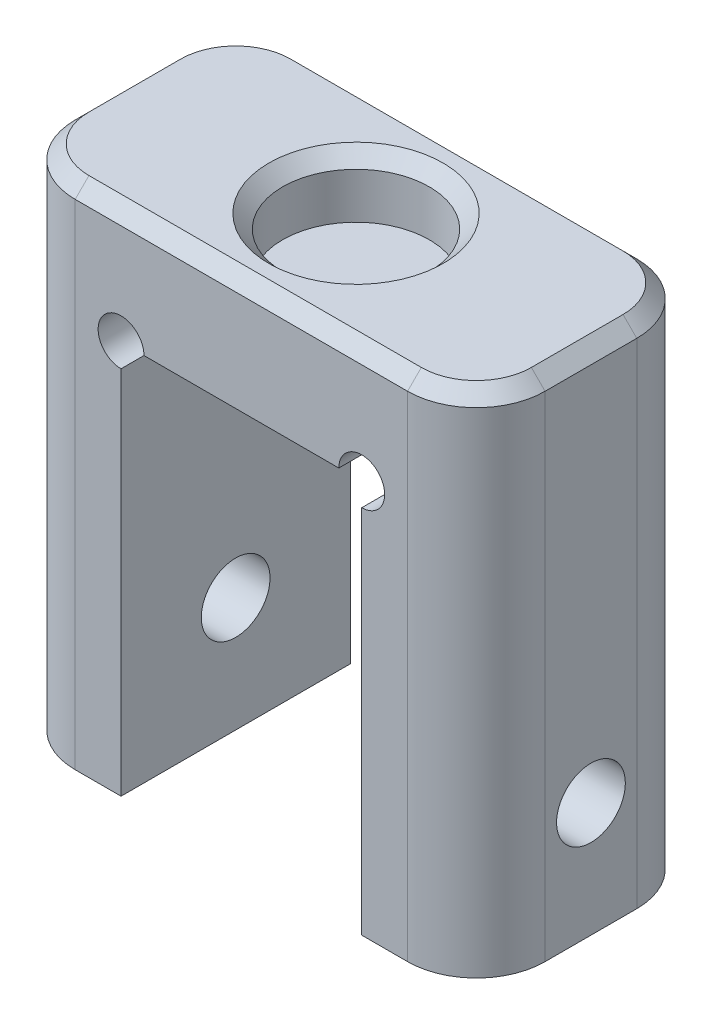
ISO-10303-21;
HEADER;
FILE_DESCRIPTION(('STEP AP214'),'2;1');
FILE_NAME('part.step','',(''),(''),'','','');
FILE_SCHEMA(('AUTOMOTIVE_DESIGN { 1 0 10303 214 1 1 1 1 }'));
ENDSEC;
DATA;
#1=APPLICATION_CONTEXT('core data for automotive mechanical design processes');
#2=APPLICATION_PROTOCOL_DEFINITION('international standard','automotive_design',2000,#1);
#3=PRODUCT_CONTEXT('',#1,'mechanical');
#4=PRODUCT('Part','Part','',(#3));
#5=PRODUCT_RELATED_PRODUCT_CATEGORY('part','',(#4));
#6=PRODUCT_DEFINITION_FORMATION('','',#4);
#7=PRODUCT_DEFINITION_CONTEXT('part definition',#1,'design');
#8=PRODUCT_DEFINITION('design','',#6,#7);
#9=PRODUCT_DEFINITION_SHAPE('','',#8);
#10=(LENGTH_UNIT() NAMED_UNIT(*) SI_UNIT(.MILLI.,.METRE.));
#11=(NAMED_UNIT(*) PLANE_ANGLE_UNIT() SI_UNIT($,.RADIAN.));
#12=(NAMED_UNIT(*) SI_UNIT($,.STERADIAN.) SOLID_ANGLE_UNIT());
#13=UNCERTAINTY_MEASURE_WITH_UNIT(LENGTH_MEASURE(1.E-05),#10,'distance_accuracy_value','');
#14=(GEOMETRIC_REPRESENTATION_CONTEXT(3) GLOBAL_UNCERTAINTY_ASSIGNED_CONTEXT((#13)) GLOBAL_UNIT_ASSIGNED_CONTEXT((#10,
#11,#12)) REPRESENTATION_CONTEXT('',''));
#15=CARTESIAN_POINT('',(0.,0.,0.));
#16=DIRECTION('',(0.,0.,1.));
#17=DIRECTION('',(1.,0.,0.));
#18=AXIS2_PLACEMENT_3D('',#15,#16,#17);
#19=CARTESIAN_POINT('',(0.,6.075,10.));
#20=DIRECTION('',(0.,1.,0.));
#21=DIRECTION('',(0.,0.,1.));
#22=AXIS2_PLACEMENT_3D('',#19,#20,#21);
#23=PLANE('',#22);
#24=DIRECTION('',(1.,0.,0.));
#25=VECTOR('',#24,1.);
#26=CARTESIAN_POINT('',(0.,6.075,0.));
#27=LINE('',#26,#25);
#28=CARTESIAN_POINT('',(-4.25,6.075,0.));
#29=VERTEX_POINT('',#28);
#30=CARTESIAN_POINT('',(4.25,6.075,0.));
#31=VERTEX_POINT('',#30);
#32=EDGE_CURVE('E180',#29,#31,#27,.T.);
#33=ORIENTED_EDGE('',*,*,#32,.T.);
#34=DIRECTION('',(0.,0.,1.));
#35=VECTOR('',#34,1.);
#36=CARTESIAN_POINT('',(4.25,6.075,0.));
#37=LINE('',#36,#35);
#38=CARTESIAN_POINT('',(4.25,6.075,10.));
#39=VERTEX_POINT('',#38);
#40=EDGE_CURVE('E67',#31,#39,#37,.T.);
#41=ORIENTED_EDGE('',*,*,#40,.T.);
#42=DIRECTION('',(1.,0.,0.));
#43=VECTOR('',#42,1.);
#44=CARTESIAN_POINT('',(0.,6.075,10.));
#45=LINE('',#44,#43);
#46=CARTESIAN_POINT('',(-4.25,6.075,10.));
#47=VERTEX_POINT('',#46);
#48=EDGE_CURVE('E182',#47,#39,#45,.T.);
#49=ORIENTED_EDGE('',*,*,#48,.F.);
#50=DIRECTION('',(0.,0.,1.));
#51=VECTOR('',#50,1.);
#52=CARTESIAN_POINT('',(-4.25,6.075,0.));
#53=LINE('',#52,#51);
#54=EDGE_CURVE('E168',#47,#29,#53,.F.);
#55=ORIENTED_EDGE('',*,*,#54,.T.);
#56=EDGE_LOOP('',(#33,#41,#49,#55));
#57=FACE_BOUND('',#56,.T.);
#58=ADVANCED_FACE('F42',(#57),#23,.F.);
#59=CARTESIAN_POINT('',(5.25,0.,10.));
#60=DIRECTION('',(1.,0.,0.));
#61=DIRECTION('',(0.,1.,0.));
#62=AXIS2_PLACEMENT_3D('',#59,#60,#61);
#63=PLANE('',#62);
#64=CARTESIAN_POINT('',(5.25000000000001,-6.07499999999999,5.));
#65=DIRECTION('',(1.,0.,0.));
#66=DIRECTION('',(0.,1.,0.));
#67=AXIS2_PLACEMENT_3D('',#64,#65,#66);
#68=CIRCLE('',#67,1.5);
#69=CARTESIAN_POINT('',(5.25000000000001,-4.57499999999999,5.));
#70=VERTEX_POINT('',#69);
#71=EDGE_CURVE('E197',#70,#70,#68,.T.);
#72=ORIENTED_EDGE('',*,*,#71,.T.);
#73=EDGE_LOOP('',(#72));
#74=FACE_BOUND('',#73,.T.);
#75=DIRECTION('',(0.,-1.,0.));
#76=VECTOR('',#75,1.);
#77=CARTESIAN_POINT('',(5.25,0.,10.));
#78=LINE('',#77,#76);
#79=CARTESIAN_POINT('',(5.25,5.075,10.));
#80=VERTEX_POINT('',#79);
#81=CARTESIAN_POINT('',(5.25000000000001,-11.075,10.));
#82=VERTEX_POINT('',#81);
#83=EDGE_CURVE('E376',#80,#82,#78,.T.);
#84=ORIENTED_EDGE('',*,*,#83,.F.);
#85=DIRECTION('',(0.,0.,1.));
#86=VECTOR('',#85,1.);
#87=CARTESIAN_POINT('',(5.25,5.075,0.));
#88=LINE('',#87,#86);
#89=CARTESIAN_POINT('',(5.25,5.075,0.));
#90=VERTEX_POINT('',#89);
#91=EDGE_CURVE('E184',#80,#90,#88,.F.);
#92=ORIENTED_EDGE('',*,*,#91,.T.);
#93=DIRECTION('',(0.,-1.,0.));
#94=VECTOR('',#93,1.);
#95=CARTESIAN_POINT('',(5.25,0.,0.));
#96=LINE('',#95,#94);
#97=CARTESIAN_POINT('',(5.25000000000001,-11.075,0.));
#98=VERTEX_POINT('',#97);
#99=EDGE_CURVE('E189',#90,#98,#96,.T.);
#100=ORIENTED_EDGE('',*,*,#99,.T.);
#101=DIRECTION('',(0.,0.,-1.));
#102=VECTOR('',#101,1.);
#103=CARTESIAN_POINT('',(5.25000000000001,-11.075,10.));
#104=LINE('',#103,#102);
#105=EDGE_CURVE('E222',#82,#98,#104,.T.);
#106=ORIENTED_EDGE('',*,*,#105,.F.);
#107=EDGE_LOOP('',(#84,#92,#100,#106));
#108=FACE_BOUND('',#107,.T.);
#109=ADVANCED_FACE('F410',(#74,#108),#63,.F.);
#110=CARTESIAN_POINT('',(0.,-11.075,10.));
#111=DIRECTION('',(0.,1.,0.));
#112=DIRECTION('',(-1.,0.,0.));
#113=AXIS2_PLACEMENT_3D('',#110,#111,#112);
#114=PLANE('',#113);
#115=DIRECTION('',(1.,0.,0.));
#116=VECTOR('',#115,1.);
#117=CARTESIAN_POINT('',(0.,-11.075,0.));
#118=LINE('',#117,#116);
#119=CARTESIAN_POINT('',(7.25000000000001,-11.075,0.));
#120=VERTEX_POINT('',#119);
#121=EDGE_CURVE('E194',#98,#120,#118,.T.);
#122=ORIENTED_EDGE('',*,*,#121,.T.);
#123=CARTESIAN_POINT('',(7.25000000000001,-11.075,3.));
#124=DIRECTION('',(0.,1.,0.));
#125=DIRECTION('',(-1.,0.,0.));
#126=AXIS2_PLACEMENT_3D('',#123,#124,#125);
#127=CIRCLE('',#126,3.);
#128=CARTESIAN_POINT('',(10.25,-11.075,3.));
#129=VERTEX_POINT('',#128);
#130=EDGE_CURVE('E268',#120,#129,#127,.F.);
#131=ORIENTED_EDGE('',*,*,#130,.T.);
#132=DIRECTION('',(0.,0.,-1.));
#133=VECTOR('',#132,1.);
#134=CARTESIAN_POINT('',(10.25,-11.075,10.));
#135=LINE('',#134,#133);
#136=CARTESIAN_POINT('',(10.25,-11.075,7.));
#137=VERTEX_POINT('',#136);
#138=EDGE_CURVE('E218',#137,#129,#135,.T.);
#139=ORIENTED_EDGE('',*,*,#138,.F.);
#140=CARTESIAN_POINT('',(7.25000000000001,-11.075,7.));
#141=DIRECTION('',(0.,1.,0.));
#142=DIRECTION('',(-1.,0.,0.));
#143=AXIS2_PLACEMENT_3D('',#140,#141,#142);
#144=CIRCLE('',#143,3.);
#145=CARTESIAN_POINT('',(7.25000000000001,-11.075,10.));
#146=VERTEX_POINT('',#145);
#147=EDGE_CURVE('E265',#137,#146,#144,.F.);
#148=ORIENTED_EDGE('',*,*,#147,.T.);
#149=DIRECTION('',(1.,0.,0.));
#150=VECTOR('',#149,1.);
#151=CARTESIAN_POINT('',(0.,-11.075,10.));
#152=LINE('',#151,#150);
#153=EDGE_CURVE('E378',#82,#146,#152,.T.);
#154=ORIENTED_EDGE('',*,*,#153,.F.);
#155=ORIENTED_EDGE('',*,*,#105,.T.);
#156=EDGE_LOOP('',(#122,#131,#139,#148,#154,#155));
#157=FACE_BOUND('',#156,.T.);
#158=ADVANCED_FACE('F413',(#157),#114,.F.);
#159=CARTESIAN_POINT('',(10.25,0.,10.));
#160=DIRECTION('',(-1.,0.,0.));
#161=DIRECTION('',(0.,-1.,0.));
#162=AXIS2_PLACEMENT_3D('',#159,#160,#161);
#163=PLANE('',#162);
#164=CARTESIAN_POINT('',(10.25,-6.07499999999999,5.));
#165=DIRECTION('',(1.,0.,0.));
#166=DIRECTION('',(0.,1.,0.));
#167=AXIS2_PLACEMENT_3D('',#164,#165,#166);
#168=CIRCLE('',#167,1.5);
#169=CARTESIAN_POINT('',(10.25,-4.57499999999999,5.));
#170=VERTEX_POINT('',#169);
#171=EDGE_CURVE('E356',#170,#170,#168,.T.);
#172=ORIENTED_EDGE('',*,*,#171,.F.);
#173=EDGE_LOOP('',(#172));
#174=FACE_BOUND('',#173,.T.);
#175=DIRECTION('',(0.,1.,0.));
#176=VECTOR('',#175,1.);
#177=CARTESIAN_POINT('',(10.25,0.,3.));
#178=LINE('',#177,#176);
#179=CARTESIAN_POINT('',(10.25,10.475,3.));
#180=VERTEX_POINT('',#179);
#181=EDGE_CURVE('E261',#129,#180,#178,.T.);
#182=ORIENTED_EDGE('',*,*,#181,.T.);
#183=DIRECTION('',(0.,0.,1.));
#184=VECTOR('',#183,1.);
#185=CARTESIAN_POINT('',(10.25,10.475,7.));
#186=LINE('',#185,#184);
#187=CARTESIAN_POINT('',(10.25,10.475,7.));
#188=VERTEX_POINT('',#187);
#189=EDGE_CURVE('E310',#180,#188,#186,.T.);
#190=ORIENTED_EDGE('',*,*,#189,.T.);
#191=DIRECTION('',(0.,1.,0.));
#192=VECTOR('',#191,1.);
#193=CARTESIAN_POINT('',(10.25,-11.075,7.));
#194=LINE('',#193,#192);
#195=EDGE_CURVE('E258',#188,#137,#194,.F.);
#196=ORIENTED_EDGE('',*,*,#195,.T.);
#197=ORIENTED_EDGE('',*,*,#138,.T.);
#198=EDGE_LOOP('',(#182,#190,#196,#197));
#199=FACE_BOUND('',#198,.T.);
#200=ADVANCED_FACE('F476',(#174,#199),#163,.F.);
#201=CARTESIAN_POINT('',(0.,11.075,10.));
#202=DIRECTION('',(0.,1.,0.));
#203=DIRECTION('',(-1.,0.,0.));
#204=AXIS2_PLACEMENT_3D('',#201,#202,#203);
#205=PLANE('',#204);
#206=DIRECTION('',(-1.,0.,0.));
#207=VECTOR('',#206,1.);
#208=CARTESIAN_POINT('',(-7.25,11.075,0.6));
#209=LINE('',#208,#207);
#210=CARTESIAN_POINT('',(7.25000000000001,11.075,0.600000000000001));
#211=VERTEX_POINT('',#210);
#212=CARTESIAN_POINT('',(-7.25,11.075,0.6));
#213=VERTEX_POINT('',#212);
#214=EDGE_CURVE('E293',#211,#213,#209,.T.);
#215=ORIENTED_EDGE('',*,*,#214,.T.);
#216=CARTESIAN_POINT('',(-7.25,11.075,3.));
#217=DIRECTION('',(0.,1.,0.));
#218=DIRECTION('',(-1.,0.,0.));
#219=AXIS2_PLACEMENT_3D('',#216,#217,#218);
#220=CIRCLE('',#219,2.4);
#221=CARTESIAN_POINT('',(-9.65000000000001,11.075,3.));
#222=VERTEX_POINT('',#221);
#223=EDGE_CURVE('E296',#213,#222,#220,.T.);
#224=ORIENTED_EDGE('',*,*,#223,.T.);
#225=DIRECTION('',(0.,0.,1.));
#226=VECTOR('',#225,1.);
#227=CARTESIAN_POINT('',(-9.65000000000001,11.075,10.));
#228=LINE('',#227,#226);
#229=CARTESIAN_POINT('',(-9.65000000000001,11.075,7.));
#230=VERTEX_POINT('',#229);
#231=EDGE_CURVE('E275',#222,#230,#228,.T.);
#232=ORIENTED_EDGE('',*,*,#231,.T.);
#233=CARTESIAN_POINT('',(-7.25,11.075,7.));
#234=DIRECTION('',(0.,1.,0.));
#235=DIRECTION('',(-1.,0.,0.));
#236=AXIS2_PLACEMENT_3D('',#233,#234,#235);
#237=CIRCLE('',#236,2.4);
#238=CARTESIAN_POINT('',(-7.25,11.075,9.4));
#239=VERTEX_POINT('',#238);
#240=EDGE_CURVE('E278',#230,#239,#237,.T.);
#241=ORIENTED_EDGE('',*,*,#240,.T.);
#242=DIRECTION('',(1.,0.,0.));
#243=VECTOR('',#242,1.);
#244=CARTESIAN_POINT('',(0.,11.075,9.4));
#245=LINE('',#244,#243);
#246=CARTESIAN_POINT('',(7.25000000000001,11.075,9.4));
#247=VERTEX_POINT('',#246);
#248=EDGE_CURVE('E281',#239,#247,#245,.T.);
#249=ORIENTED_EDGE('',*,*,#248,.T.);
#250=CARTESIAN_POINT('',(7.25000000000001,11.075,7.));
#251=DIRECTION('',(0.,1.,0.));
#252=DIRECTION('',(-1.,0.,0.));
#253=AXIS2_PLACEMENT_3D('',#250,#251,#252);
#254=CIRCLE('',#253,2.4);
#255=CARTESIAN_POINT('',(9.65000000000001,11.075,7.));
#256=VERTEX_POINT('',#255);
#257=EDGE_CURVE('E284',#247,#256,#254,.T.);
#258=ORIENTED_EDGE('',*,*,#257,.T.);
#259=DIRECTION('',(0.,0.,-1.));
#260=VECTOR('',#259,1.);
#261=CARTESIAN_POINT('',(9.65000000000001,11.075,3.));
#262=LINE('',#261,#260);
#263=CARTESIAN_POINT('',(9.65000000000001,11.075,3.));
#264=VERTEX_POINT('',#263);
#265=EDGE_CURVE('E287',#256,#264,#262,.T.);
#266=ORIENTED_EDGE('',*,*,#265,.T.);
#267=CARTESIAN_POINT('',(7.25000000000001,11.075,3.));
#268=DIRECTION('',(0.,1.,0.));
#269=DIRECTION('',(-1.,0.,0.));
#270=AXIS2_PLACEMENT_3D('',#267,#268,#269);
#271=CIRCLE('',#270,2.4);
#272=EDGE_CURVE('E290',#264,#211,#271,.T.);
#273=ORIENTED_EDGE('',*,*,#272,.T.);
#274=EDGE_LOOP('',(#215,#224,#232,#241,#249,#258,#266,#273));
#275=FACE_BOUND('',#274,.T.);
#276=CARTESIAN_POINT('',(0.,11.075,5.));
#277=DIRECTION('',(0.,1.,0.));
#278=DIRECTION('',(-1.,0.,0.));
#279=AXIS2_PLACEMENT_3D('',#276,#277,#278);
#280=CIRCLE('',#279,3.8);
#281=CARTESIAN_POINT('',(-3.8,11.075,5.));
#282=VERTEX_POINT('',#281);
#283=EDGE_CURVE('E271',#282,#282,#280,.F.);
#284=ORIENTED_EDGE('',*,*,#283,.T.);
#285=EDGE_LOOP('',(#284));
#286=FACE_BOUND('',#285,.T.);
#287=ADVANCED_FACE('F472',(#275,#286),#205,.T.);
#288=CARTESIAN_POINT('',(-10.25,0.,10.));
#289=DIRECTION('',(-1.,0.,0.));
#290=DIRECTION('',(0.,-1.,0.));
#291=AXIS2_PLACEMENT_3D('',#288,#289,#290);
#292=PLANE('',#291);
#293=CARTESIAN_POINT('',(-10.25,-6.07499999999999,5.));
#294=DIRECTION('',(1.,0.,0.));
#295=DIRECTION('',(0.,1.,0.));
#296=AXIS2_PLACEMENT_3D('',#293,#294,#295);
#297=CIRCLE('',#296,1.5);
#298=CARTESIAN_POINT('',(-10.25,-4.57499999999999,5.));
#299=VERTEX_POINT('',#298);
#300=EDGE_CURVE('E231',#299,#299,#297,.T.);
#301=ORIENTED_EDGE('',*,*,#300,.T.);
#302=EDGE_LOOP('',(#301));
#303=FACE_BOUND('',#302,.T.);
#304=DIRECTION('',(0.,1.,0.));
#305=VECTOR('',#304,1.);
#306=CARTESIAN_POINT('',(-10.25,0.,7.));
#307=LINE('',#306,#305);
#308=CARTESIAN_POINT('',(-10.25,-11.075,7.));
#309=VERTEX_POINT('',#308);
#310=CARTESIAN_POINT('',(-10.25,10.475,7.));
#311=VERTEX_POINT('',#310);
#312=EDGE_CURVE('E234',#309,#311,#307,.T.);
#313=ORIENTED_EDGE('',*,*,#312,.T.);
#314=DIRECTION('',(0.,0.,-1.));
#315=VECTOR('',#314,1.);
#316=CARTESIAN_POINT('',(-10.25,10.475,10.));
#317=LINE('',#316,#315);
#318=CARTESIAN_POINT('',(-10.25,10.475,3.));
#319=VERTEX_POINT('',#318);
#320=EDGE_CURVE('E322',#311,#319,#317,.T.);
#321=ORIENTED_EDGE('',*,*,#320,.T.);
#322=DIRECTION('',(0.,1.,0.));
#323=VECTOR('',#322,1.);
#324=CARTESIAN_POINT('',(-10.25,-11.075,3.));
#325=LINE('',#324,#323);
#326=CARTESIAN_POINT('',(-10.25,-11.075,3.));
#327=VERTEX_POINT('',#326);
#328=EDGE_CURVE('E226',#319,#327,#325,.F.);
#329=ORIENTED_EDGE('',*,*,#328,.T.);
#330=DIRECTION('',(0.,0.,-1.));
#331=VECTOR('',#330,1.);
#332=CARTESIAN_POINT('',(-10.25,-11.075,10.));
#333=LINE('',#332,#331);
#334=EDGE_CURVE('E214',#309,#327,#333,.T.);
#335=ORIENTED_EDGE('',*,*,#334,.F.);
#336=EDGE_LOOP('',(#313,#321,#329,#335));
#337=FACE_BOUND('',#336,.T.);
#338=ADVANCED_FACE('F442',(#303,#337),#292,.T.);
#339=CARTESIAN_POINT('',(-7.25,-11.075,10.));
#340=VERTEX_POINT('',#339);
#341=CARTESIAN_POINT('',(-5.25,-11.075,10.));
#342=VERTEX_POINT('',#341);
#343=EDGE_CURVE('E381',#340,#342,#152,.T.);
#344=ORIENTED_EDGE('',*,*,#343,.F.);
#345=CARTESIAN_POINT('',(-7.25,-11.075,7.));
#346=DIRECTION('',(0.,1.,0.));
#347=DIRECTION('',(-1.,0.,0.));
#348=AXIS2_PLACEMENT_3D('',#345,#346,#347);
#349=CIRCLE('',#348,3.);
#350=EDGE_CURVE('E248',#340,#309,#349,.F.);
#351=ORIENTED_EDGE('',*,*,#350,.T.);
#352=ORIENTED_EDGE('',*,*,#334,.T.);
#353=CARTESIAN_POINT('',(-7.25,-11.075,3.));
#354=DIRECTION('',(0.,1.,0.));
#355=DIRECTION('',(-1.,0.,0.));
#356=AXIS2_PLACEMENT_3D('',#353,#354,#355);
#357=CIRCLE('',#356,3.);
#358=CARTESIAN_POINT('',(-7.25,-11.075,0.));
#359=VERTEX_POINT('',#358);
#360=EDGE_CURVE('E245',#327,#359,#357,.F.);
#361=ORIENTED_EDGE('',*,*,#360,.T.);
#362=CARTESIAN_POINT('',(-5.25,-11.075,0.));
#363=VERTEX_POINT('',#362);
#364=EDGE_CURVE('E206',#359,#363,#118,.T.);
#365=ORIENTED_EDGE('',*,*,#364,.T.);
#366=DIRECTION('',(0.,0.,-1.));
#367=VECTOR('',#366,1.);
#368=CARTESIAN_POINT('',(-5.25,-11.075,10.));
#369=LINE('',#368,#367);
#370=EDGE_CURVE('E210',#342,#363,#369,.T.);
#371=ORIENTED_EDGE('',*,*,#370,.F.);
#372=EDGE_LOOP('',(#344,#351,#352,#361,#365,#371));
#373=FACE_BOUND('',#372,.T.);
#374=ADVANCED_FACE('F446',(#373),#114,.F.);
#375=CARTESIAN_POINT('',(-5.25,0.,10.));
#376=DIRECTION('',(1.,0.,0.));
#377=DIRECTION('',(0.,1.,0.));
#378=AXIS2_PLACEMENT_3D('',#375,#376,#377);
#379=PLANE('',#378);
#380=DIRECTION('',(0.,0.,1.));
#381=VECTOR('',#380,1.);
#382=CARTESIAN_POINT('',(-5.25,5.075,0.));
#383=LINE('',#382,#381);
#384=CARTESIAN_POINT('',(-5.25,5.075,10.));
#385=VERTEX_POINT('',#384);
#386=CARTESIAN_POINT('',(-5.25,5.075,0.));
#387=VERTEX_POINT('',#386);
#388=EDGE_CURVE('E59',#385,#387,#383,.F.);
#389=ORIENTED_EDGE('',*,*,#388,.F.);
#390=DIRECTION('',(0.,-1.,0.));
#391=VECTOR('',#390,1.);
#392=CARTESIAN_POINT('',(-5.25,0.,10.));
#393=LINE('',#392,#391);
#394=EDGE_CURVE('E200',#385,#342,#393,.T.);
#395=ORIENTED_EDGE('',*,*,#394,.T.);
#396=ORIENTED_EDGE('',*,*,#370,.T.);
#397=DIRECTION('',(0.,-1.,0.));
#398=VECTOR('',#397,1.);
#399=CARTESIAN_POINT('',(-5.25,0.,0.));
#400=LINE('',#399,#398);
#401=EDGE_CURVE('E207',#387,#363,#400,.T.);
#402=ORIENTED_EDGE('',*,*,#401,.F.);
#403=EDGE_LOOP('',(#389,#395,#396,#402));
#404=FACE_BOUND('',#403,.T.);
#405=CARTESIAN_POINT('',(-5.24999999999999,-6.07499999999999,5.));
#406=DIRECTION('',(1.,0.,0.));
#407=DIRECTION('',(0.,1.,0.));
#408=AXIS2_PLACEMENT_3D('',#405,#406,#407);
#409=CIRCLE('',#408,1.5);
#410=CARTESIAN_POINT('',(-5.25,-4.57499999999999,5.));
#411=VERTEX_POINT('',#410);
#412=EDGE_CURVE('E227',#411,#411,#409,.T.);
#413=ORIENTED_EDGE('',*,*,#412,.F.);
#414=EDGE_LOOP('',(#413));
#415=FACE_BOUND('',#414,.T.);
#416=ADVANCED_FACE('F392',(#404,#415),#379,.T.);
#417=CARTESIAN_POINT('',(0.,0.,10.));
#418=DIRECTION('',(0.,0.,1.));
#419=DIRECTION('',(1.,0.,0.));
#420=AXIS2_PLACEMENT_3D('',#417,#418,#419);
#421=PLANE('',#420);
#422=CARTESIAN_POINT('',(5.25,6.075,10.));
#423=DIRECTION('',(0.,0.,1.));
#424=DIRECTION('',(1.,0.,0.));
#425=AXIS2_PLACEMENT_3D('',#422,#423,#424);
#426=CIRCLE('',#425,1.);
#427=EDGE_CURVE('E174',#80,#39,#426,.T.);
#428=ORIENTED_EDGE('',*,*,#427,.F.);
#429=ORIENTED_EDGE('',*,*,#83,.T.);
#430=ORIENTED_EDGE('',*,*,#153,.T.);
#431=DIRECTION('',(0.,1.,0.));
#432=VECTOR('',#431,1.);
#433=CARTESIAN_POINT('',(7.25000000000001,11.075,10.));
#434=LINE('',#433,#432);
#435=CARTESIAN_POINT('',(7.25000000000001,10.475,10.));
#436=VERTEX_POINT('',#435);
#437=EDGE_CURVE('E238',#146,#436,#434,.T.);
#438=ORIENTED_EDGE('',*,*,#437,.T.);
#439=DIRECTION('',(-1.,0.,0.));
#440=VECTOR('',#439,1.);
#441=CARTESIAN_POINT('',(0.,10.475,10.));
#442=LINE('',#441,#440);
#443=CARTESIAN_POINT('',(-7.25,10.475,10.));
#444=VERTEX_POINT('',#443);
#445=EDGE_CURVE('E316',#436,#444,#442,.T.);
#446=ORIENTED_EDGE('',*,*,#445,.T.);
#447=DIRECTION('',(0.,1.,0.));
#448=VECTOR('',#447,1.);
#449=CARTESIAN_POINT('',(-7.25,0.,10.));
#450=LINE('',#449,#448);
#451=EDGE_CURVE('E242',#444,#340,#450,.F.);
#452=ORIENTED_EDGE('',*,*,#451,.T.);
#453=ORIENTED_EDGE('',*,*,#343,.T.);
#454=ORIENTED_EDGE('',*,*,#394,.F.);
#455=CARTESIAN_POINT('',(-5.25,6.075,10.));
#456=DIRECTION('',(0.,0.,1.));
#457=DIRECTION('',(1.,0.,0.));
#458=AXIS2_PLACEMENT_3D('',#455,#456,#457);
#459=CIRCLE('',#458,1.);
#460=EDGE_CURVE('E175',#47,#385,#459,.T.);
#461=ORIENTED_EDGE('',*,*,#460,.F.);
#462=ORIENTED_EDGE('',*,*,#48,.T.);
#463=EDGE_LOOP('',(#428,#429,#430,#438,#446,#452,#453,#454,#461,#462));
#464=FACE_BOUND('',#463,.T.);
#465=ADVANCED_FACE('F395',(#464),#421,.T.);
#466=CARTESIAN_POINT('',(0.,0.,0.));
#467=DIRECTION('',(0.,0.,1.));
#468=DIRECTION('',(1.,0.,0.));
#469=AXIS2_PLACEMENT_3D('',#466,#467,#468);
#470=PLANE('',#469);
#471=ORIENTED_EDGE('',*,*,#99,.F.);
#472=CARTESIAN_POINT('',(5.25,6.075,0.));
#473=DIRECTION('',(0.,0.,1.));
#474=DIRECTION('',(1.,0.,0.));
#475=AXIS2_PLACEMENT_3D('',#472,#473,#474);
#476=CIRCLE('',#475,1.);
#477=EDGE_CURVE('E11',#90,#31,#476,.T.);
#478=ORIENTED_EDGE('',*,*,#477,.T.);
#479=ORIENTED_EDGE('',*,*,#32,.F.);
#480=CARTESIAN_POINT('',(-5.25,6.075,0.));
#481=DIRECTION('',(0.,0.,1.));
#482=DIRECTION('',(1.,0.,0.));
#483=AXIS2_PLACEMENT_3D('',#480,#481,#482);
#484=CIRCLE('',#483,1.);
#485=EDGE_CURVE('E165',#29,#387,#484,.T.);
#486=ORIENTED_EDGE('',*,*,#485,.T.);
#487=ORIENTED_EDGE('',*,*,#401,.T.);
#488=ORIENTED_EDGE('',*,*,#364,.F.);
#489=DIRECTION('',(0.,1.,0.));
#490=VECTOR('',#489,1.);
#491=CARTESIAN_POINT('',(-7.25,11.075,0.));
#492=LINE('',#491,#490);
#493=CARTESIAN_POINT('',(-7.25,10.475,0.));
#494=VERTEX_POINT('',#493);
#495=EDGE_CURVE('E254',#359,#494,#492,.T.);
#496=ORIENTED_EDGE('',*,*,#495,.T.);
#497=DIRECTION('',(1.,0.,0.));
#498=VECTOR('',#497,1.);
#499=CARTESIAN_POINT('',(7.25000000000001,10.475,0.));
#500=LINE('',#499,#498);
#501=CARTESIAN_POINT('',(7.25000000000001,10.475,0.));
#502=VERTEX_POINT('',#501);
#503=EDGE_CURVE('E304',#494,#502,#500,.T.);
#504=ORIENTED_EDGE('',*,*,#503,.T.);
#505=DIRECTION('',(0.,1.,0.));
#506=VECTOR('',#505,1.);
#507=CARTESIAN_POINT('',(7.25000000000001,0.,0.));
#508=LINE('',#507,#506);
#509=EDGE_CURVE('E251',#502,#120,#508,.F.);
#510=ORIENTED_EDGE('',*,*,#509,.T.);
#511=ORIENTED_EDGE('',*,*,#121,.F.);
#512=EDGE_LOOP('',(#471,#478,#479,#486,#487,#488,#496,#504,#510,#511));
#513=FACE_BOUND('',#512,.T.);
#514=ADVANCED_FACE('F187',(#513),#470,.F.);
#515=CARTESIAN_POINT('',(0.,8.475,5.));
#516=DIRECTION('',(0.,1.,0.));
#517=DIRECTION('',(-1.,0.,0.));
#518=AXIS2_PLACEMENT_3D('',#515,#516,#517);
#519=CYLINDRICAL_SURFACE('',#518,3.2);
#520=CARTESIAN_POINT('',(0.,10.475,5.));
#521=DIRECTION('',(0.,1.,0.));
#522=DIRECTION('',(-1.,0.,0.));
#523=AXIS2_PLACEMENT_3D('',#520,#521,#522);
#524=CIRCLE('',#523,3.2);
#525=CARTESIAN_POINT('',(-3.2,10.475,5.));
#526=VERTEX_POINT('',#525);
#527=EDGE_CURVE('E52',#526,#526,#524,.T.);
#528=ORIENTED_EDGE('',*,*,#527,.T.);
#529=EDGE_LOOP('',(#528));
#530=FACE_BOUND('',#529,.T.);
#531=CARTESIAN_POINT('',(0.,8.475,5.));
#532=DIRECTION('',(0.,1.,0.));
#533=DIRECTION('',(-1.,0.,0.));
#534=AXIS2_PLACEMENT_3D('',#531,#532,#533);
#535=CIRCLE('',#534,3.2);
#536=CARTESIAN_POINT('',(-3.2,8.475,5.));
#537=VERTEX_POINT('',#536);
#538=EDGE_CURVE('E190',#537,#537,#535,.T.);
#539=ORIENTED_EDGE('',*,*,#538,.F.);
#540=EDGE_LOOP('',(#539));
#541=FACE_BOUND('',#540,.T.);
#542=ADVANCED_FACE('F663',(#530,#541),#519,.F.);
#543=CARTESIAN_POINT('',(0.,8.475,5.));
#544=DIRECTION('',(0.,1.,0.));
#545=DIRECTION('',(-1.,0.,0.));
#546=AXIS2_PLACEMENT_3D('',#543,#544,#545);
#547=PLANE('',#546);
#548=ORIENTED_EDGE('',*,*,#538,.T.);
#549=EDGE_LOOP('',(#548));
#550=FACE_BOUND('',#549,.T.);
#551=ADVANCED_FACE('F655',(#550),#547,.T.);
#552=CARTESIAN_POINT('',(-10.25,-6.07499999999999,5.));
#553=DIRECTION('',(1.,0.,0.));
#554=DIRECTION('',(0.,1.,0.));
#555=AXIS2_PLACEMENT_3D('',#552,#553,#554);
#556=CYLINDRICAL_SURFACE('',#555,1.5);
#557=ORIENTED_EDGE('',*,*,#412,.T.);
#558=EDGE_LOOP('',(#557));
#559=FACE_BOUND('',#558,.T.);
#560=ORIENTED_EDGE('',*,*,#300,.F.);
#561=EDGE_LOOP('',(#560));
#562=FACE_BOUND('',#561,.T.);
#563=ADVANCED_FACE('F646',(#559,#562),#556,.F.);
#564=ORIENTED_EDGE('',*,*,#171,.T.);
#565=EDGE_LOOP('',(#564));
#566=FACE_BOUND('',#565,.T.);
#567=ORIENTED_EDGE('',*,*,#71,.F.);
#568=EDGE_LOOP('',(#567));
#569=FACE_BOUND('',#568,.T.);
#570=ADVANCED_FACE('F497',(#566,#569),#556,.F.);
#571=CARTESIAN_POINT('',(-7.25,0.,7.));
#572=DIRECTION('',(0.,1.,0.));
#573=DIRECTION('',(-1.,0.,0.));
#574=AXIS2_PLACEMENT_3D('',#571,#572,#573);
#575=CYLINDRICAL_SURFACE('',#574,3.);
#576=ORIENTED_EDGE('',*,*,#451,.F.);
#577=CARTESIAN_POINT('',(-7.25,10.475,7.));
#578=DIRECTION('',(0.,1.,0.));
#579=DIRECTION('',(0.,0.,1.));
#580=AXIS2_PLACEMENT_3D('',#577,#578,#579);
#581=CIRCLE('',#580,3.);
#582=EDGE_CURVE('E319',#444,#311,#581,.F.);
#583=ORIENTED_EDGE('',*,*,#582,.T.);
#584=ORIENTED_EDGE('',*,*,#312,.F.);
#585=ORIENTED_EDGE('',*,*,#350,.F.);
#586=EDGE_LOOP('',(#576,#583,#584,#585));
#587=FACE_BOUND('',#586,.T.);
#588=ADVANCED_FACE('F438',(#587),#575,.T.);
#589=CARTESIAN_POINT('',(-7.25,0.,3.));
#590=DIRECTION('',(0.,-1.,0.));
#591=DIRECTION('',(1.,0.,0.));
#592=AXIS2_PLACEMENT_3D('',#589,#590,#591);
#593=CYLINDRICAL_SURFACE('',#592,3.);
#594=ORIENTED_EDGE('',*,*,#328,.F.);
#595=CARTESIAN_POINT('',(-7.25,10.475,3.));
#596=DIRECTION('',(0.,1.,0.));
#597=DIRECTION('',(0.,0.,1.));
#598=AXIS2_PLACEMENT_3D('',#595,#596,#597);
#599=CIRCLE('',#598,3.);
#600=EDGE_CURVE('E300',#319,#494,#599,.F.);
#601=ORIENTED_EDGE('',*,*,#600,.T.);
#602=ORIENTED_EDGE('',*,*,#495,.F.);
#603=ORIENTED_EDGE('',*,*,#360,.F.);
#604=EDGE_LOOP('',(#594,#601,#602,#603));
#605=FACE_BOUND('',#604,.T.);
#606=ADVANCED_FACE('F451',(#605),#593,.T.);
#607=CARTESIAN_POINT('',(7.25000000000001,0.,3.));
#608=DIRECTION('',(0.,1.,0.));
#609=DIRECTION('',(-1.,0.,0.));
#610=AXIS2_PLACEMENT_3D('',#607,#608,#609);
#611=CYLINDRICAL_SURFACE('',#610,3.);
#612=ORIENTED_EDGE('',*,*,#509,.F.);
#613=CARTESIAN_POINT('',(7.25000000000001,10.475,3.));
#614=DIRECTION('',(0.,1.,0.));
#615=DIRECTION('',(0.,0.,1.));
#616=AXIS2_PLACEMENT_3D('',#613,#614,#615);
#617=CIRCLE('',#616,3.);
#618=EDGE_CURVE('E307',#502,#180,#617,.F.);
#619=ORIENTED_EDGE('',*,*,#618,.T.);
#620=ORIENTED_EDGE('',*,*,#181,.F.);
#621=ORIENTED_EDGE('',*,*,#130,.F.);
#622=EDGE_LOOP('',(#612,#619,#620,#621));
#623=FACE_BOUND('',#622,.T.);
#624=ADVANCED_FACE('F461',(#623),#611,.T.);
#625=CARTESIAN_POINT('',(7.25000000000001,0.,7.));
#626=DIRECTION('',(0.,-1.,0.));
#627=DIRECTION('',(1.,0.,0.));
#628=AXIS2_PLACEMENT_3D('',#625,#626,#627);
#629=CYLINDRICAL_SURFACE('',#628,3.);
#630=ORIENTED_EDGE('',*,*,#195,.F.);
#631=CARTESIAN_POINT('',(7.25000000000001,10.475,7.));
#632=DIRECTION('',(0.,1.,0.));
#633=DIRECTION('',(0.,0.,1.));
#634=AXIS2_PLACEMENT_3D('',#631,#632,#633);
#635=CIRCLE('',#634,3.);
#636=EDGE_CURVE('E313',#188,#436,#635,.F.);
#637=ORIENTED_EDGE('',*,*,#636,.T.);
#638=ORIENTED_EDGE('',*,*,#437,.F.);
#639=ORIENTED_EDGE('',*,*,#147,.F.);
#640=EDGE_LOOP('',(#630,#637,#638,#639));
#641=FACE_BOUND('',#640,.T.);
#642=ADVANCED_FACE('F418',(#641),#629,.T.);
#643=CARTESIAN_POINT('',(7.25000000000001,11.075,7.));
#644=DIRECTION('',(0.,-1.,0.));
#645=DIRECTION('',(0.,0.,-1.));
#646=AXIS2_PLACEMENT_3D('',#643,#644,#645);
#647=CONICAL_SURFACE('',#646,2.4,0.785398163397448);
#648=DIRECTION('',(0.,0.707106781186547,-0.707106781186547));
#649=VECTOR('',#648,1.);
#650=CARTESIAN_POINT('',(7.25000000000001,10.475,10.));
#651=LINE('',#650,#649);
#652=EDGE_CURVE('E350',#436,#247,#651,.T.);
#653=ORIENTED_EDGE('',*,*,#652,.F.);
#654=ORIENTED_EDGE('',*,*,#636,.F.);
#655=DIRECTION('',(0.707106781186547,-0.707106781186547,0.));
#656=VECTOR('',#655,1.);
#657=CARTESIAN_POINT('',(9.65000000000001,11.075,7.));
#658=LINE('',#657,#656);
#659=EDGE_CURVE('E353',#256,#188,#658,.T.);
#660=ORIENTED_EDGE('',*,*,#659,.F.);
#661=ORIENTED_EDGE('',*,*,#257,.F.);
#662=EDGE_LOOP('',(#653,#654,#660,#661));
#663=FACE_BOUND('',#662,.T.);
#664=ADVANCED_FACE('F425',(#663),#647,.T.);
#665=CARTESIAN_POINT('',(9.65000000000001,11.075,10.));
#666=DIRECTION('',(0.707106781186547,0.707106781186549,0.));
#667=DIRECTION('',(0.,0.,1.));
#668=AXIS2_PLACEMENT_3D('',#665,#666,#667);
#669=PLANE('',#668);
#670=ORIENTED_EDGE('',*,*,#659,.T.);
#671=ORIENTED_EDGE('',*,*,#189,.F.);
#672=DIRECTION('',(0.707106781186549,-0.707106781186547,0.));
#673=VECTOR('',#672,1.);
#674=CARTESIAN_POINT('',(9.65000000000001,11.075,3.));
#675=LINE('',#674,#673);
#676=EDGE_CURVE('E346',#264,#180,#675,.T.);
#677=ORIENTED_EDGE('',*,*,#676,.F.);
#678=ORIENTED_EDGE('',*,*,#265,.F.);
#679=EDGE_LOOP('',(#670,#671,#677,#678));
#680=FACE_BOUND('',#679,.T.);
#681=ADVANCED_FACE('F474',(#680),#669,.T.);
#682=CARTESIAN_POINT('',(0.,11.075,9.4));
#683=DIRECTION('',(0.,-0.707106781186547,-0.707106781186547));
#684=DIRECTION('',(1.,0.,0.));
#685=AXIS2_PLACEMENT_3D('',#682,#683,#684);
#686=PLANE('',#685);
#687=ORIENTED_EDGE('',*,*,#652,.T.);
#688=ORIENTED_EDGE('',*,*,#248,.F.);
#689=DIRECTION('',(0.,0.707106781186547,-0.707106781186547));
#690=VECTOR('',#689,1.);
#691=CARTESIAN_POINT('',(-7.25,10.475,10.));
#692=LINE('',#691,#690);
#693=EDGE_CURVE('E342',#444,#239,#692,.T.);
#694=ORIENTED_EDGE('',*,*,#693,.F.);
#695=ORIENTED_EDGE('',*,*,#445,.F.);
#696=EDGE_LOOP('',(#687,#688,#694,#695));
#697=FACE_BOUND('',#696,.T.);
#698=ADVANCED_FACE('F429',(#697),#686,.F.);
#699=CARTESIAN_POINT('',(7.25000000000001,11.075,3.));
#700=DIRECTION('',(0.,-1.,0.));
#701=DIRECTION('',(0.,0.,-1.));
#702=AXIS2_PLACEMENT_3D('',#699,#700,#701);
#703=CONICAL_SURFACE('',#702,2.4,0.785398163397449);
#704=ORIENTED_EDGE('',*,*,#676,.T.);
#705=ORIENTED_EDGE('',*,*,#618,.F.);
#706=DIRECTION('',(0.,-0.707106781186547,-0.707106781186548));
#707=VECTOR('',#706,1.);
#708=CARTESIAN_POINT('',(7.25000000000001,11.075,0.600000000000001));
#709=LINE('',#708,#707);
#710=EDGE_CURVE('E338',#211,#502,#709,.T.);
#711=ORIENTED_EDGE('',*,*,#710,.F.);
#712=ORIENTED_EDGE('',*,*,#272,.F.);
#713=EDGE_LOOP('',(#704,#705,#711,#712));
#714=FACE_BOUND('',#713,.T.);
#715=ADVANCED_FACE('F465',(#714),#703,.T.);
#716=CARTESIAN_POINT('',(-7.25,11.075,7.));
#717=DIRECTION('',(0.,-1.,0.));
#718=DIRECTION('',(0.,0.,-1.));
#719=AXIS2_PLACEMENT_3D('',#716,#717,#718);
#720=CONICAL_SURFACE('',#719,2.4,0.785398163397448);
#721=ORIENTED_EDGE('',*,*,#693,.T.);
#722=ORIENTED_EDGE('',*,*,#240,.F.);
#723=DIRECTION('',(0.707106781186547,0.707106781186547,0.));
#724=VECTOR('',#723,1.);
#725=CARTESIAN_POINT('',(-10.25,10.475,7.));
#726=LINE('',#725,#724);
#727=EDGE_CURVE('E334',#311,#230,#726,.T.);
#728=ORIENTED_EDGE('',*,*,#727,.F.);
#729=ORIENTED_EDGE('',*,*,#582,.F.);
#730=EDGE_LOOP('',(#721,#722,#728,#729));
#731=FACE_BOUND('',#730,.T.);
#732=ADVANCED_FACE('F434',(#731),#720,.T.);
#733=CARTESIAN_POINT('',(0.,10.475,0.));
#734=DIRECTION('',(0.,0.707106781186547,-0.707106781186547));
#735=DIRECTION('',(-1.,0.,0.));
#736=AXIS2_PLACEMENT_3D('',#733,#734,#735);
#737=PLANE('',#736);
#738=ORIENTED_EDGE('',*,*,#710,.T.);
#739=ORIENTED_EDGE('',*,*,#503,.F.);
#740=DIRECTION('',(0.,-0.707106781186549,-0.707106781186547));
#741=VECTOR('',#740,1.);
#742=CARTESIAN_POINT('',(-7.25,11.075,0.6));
#743=LINE('',#742,#741);
#744=EDGE_CURVE('E331',#213,#494,#743,.T.);
#745=ORIENTED_EDGE('',*,*,#744,.F.);
#746=ORIENTED_EDGE('',*,*,#214,.F.);
#747=EDGE_LOOP('',(#738,#739,#745,#746));
#748=FACE_BOUND('',#747,.T.);
#749=ADVANCED_FACE('F469',(#748),#737,.T.);
#750=CARTESIAN_POINT('',(-10.25,10.475,10.));
#751=DIRECTION('',(0.707106781186549,-0.707106781186547,0.));
#752=DIRECTION('',(0.,0.,-1.));
#753=AXIS2_PLACEMENT_3D('',#750,#751,#752);
#754=PLANE('',#753);
#755=ORIENTED_EDGE('',*,*,#727,.T.);
#756=ORIENTED_EDGE('',*,*,#231,.F.);
#757=DIRECTION('',(0.707106781186547,0.707106781186549,0.));
#758=VECTOR('',#757,1.);
#759=CARTESIAN_POINT('',(-10.25,10.475,3.));
#760=LINE('',#759,#758);
#761=EDGE_CURVE('E328',#319,#222,#760,.T.);
#762=ORIENTED_EDGE('',*,*,#761,.F.);
#763=ORIENTED_EDGE('',*,*,#320,.F.);
#764=EDGE_LOOP('',(#755,#756,#762,#763));
#765=FACE_BOUND('',#764,.T.);
#766=ADVANCED_FACE('F511',(#765),#754,.F.);
#767=CARTESIAN_POINT('',(-7.25,11.075,3.));
#768=DIRECTION('',(0.,-1.,0.));
#769=DIRECTION('',(0.,0.,-1.));
#770=AXIS2_PLACEMENT_3D('',#767,#768,#769);
#771=CONICAL_SURFACE('',#770,2.4,0.785398163397448);
#772=ORIENTED_EDGE('',*,*,#744,.T.);
#773=ORIENTED_EDGE('',*,*,#600,.F.);
#774=ORIENTED_EDGE('',*,*,#761,.T.);
#775=ORIENTED_EDGE('',*,*,#223,.F.);
#776=EDGE_LOOP('',(#772,#773,#774,#775));
#777=FACE_BOUND('',#776,.T.);
#778=ADVANCED_FACE('F505',(#777),#771,.T.);
#779=CARTESIAN_POINT('',(0.,10.475,5.));
#780=DIRECTION('',(0.,1.,0.));
#781=DIRECTION('',(-1.,0.,0.));
#782=AXIS2_PLACEMENT_3D('',#779,#780,#781);
#783=CONICAL_SURFACE('',#782,3.2,0.785398163397451);
#784=ORIENTED_EDGE('',*,*,#283,.F.);
#785=EDGE_LOOP('',(#784));
#786=FACE_BOUND('',#785,.T.);
#787=ORIENTED_EDGE('',*,*,#527,.F.);
#788=EDGE_LOOP('',(#787));
#789=FACE_BOUND('',#788,.T.);
#790=ADVANCED_FACE('F45',(#786,#789),#783,.F.);
#791=CARTESIAN_POINT('',(-5.25,6.075,0.));
#792=DIRECTION('',(0.,0.,1.));
#793=DIRECTION('',(1.,0.,0.));
#794=AXIS2_PLACEMENT_3D('',#791,#792,#793);
#795=CYLINDRICAL_SURFACE('',#794,1.);
#796=ORIENTED_EDGE('',*,*,#460,.T.);
#797=ORIENTED_EDGE('',*,*,#388,.T.);
#798=ORIENTED_EDGE('',*,*,#485,.F.);
#799=ORIENTED_EDGE('',*,*,#54,.F.);
#800=EDGE_LOOP('',(#796,#797,#798,#799));
#801=FACE_BOUND('',#800,.T.);
#802=ADVANCED_FACE('F167',(#801),#795,.F.);
#803=CARTESIAN_POINT('',(5.25,6.075,0.));
#804=DIRECTION('',(0.,0.,1.));
#805=DIRECTION('',(1.,0.,0.));
#806=AXIS2_PLACEMENT_3D('',#803,#804,#805);
#807=CYLINDRICAL_SURFACE('',#806,1.);
#808=ORIENTED_EDGE('',*,*,#477,.F.);
#809=ORIENTED_EDGE('',*,*,#91,.F.);
#810=ORIENTED_EDGE('',*,*,#427,.T.);
#811=ORIENTED_EDGE('',*,*,#40,.F.);
#812=EDGE_LOOP('',(#808,#809,#810,#811));
#813=FACE_BOUND('',#812,.T.);
#814=ADVANCED_FACE('F406',(#813),#807,.F.);
#815=CLOSED_SHELL('',(#58,#109,#158,#200,#287,#338,#374,#416,#465,#514,#542,#551,#563,#570,#588,
#606,#624,#642,#664,#681,#698,#715,#732,#749,#766,#778,#790,#802,#814));
#816=MANIFOLD_SOLID_BREP('B2',#815);
#817=ADVANCED_BREP_SHAPE_REPRESENTATION('',(#18,#816),#14);
#818=SHAPE_DEFINITION_REPRESENTATION(#9,#817);
ENDSEC;
END-ISO-10303-21;
